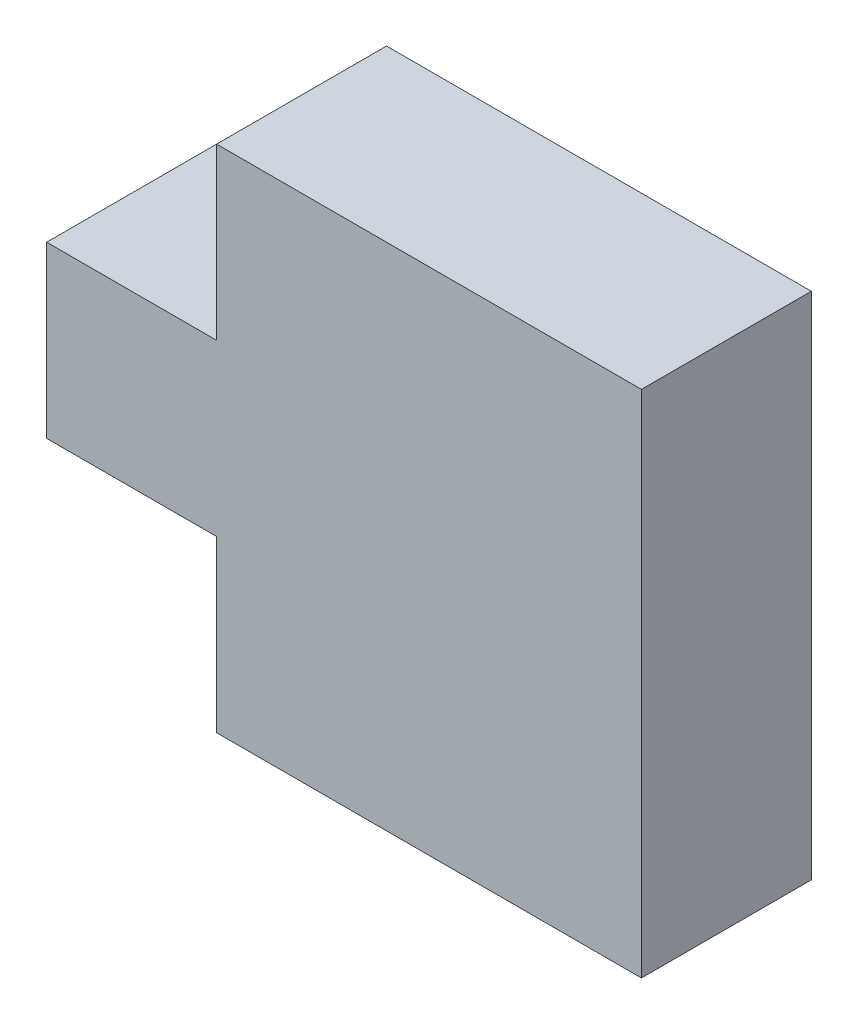
ISO-10303-21;
HEADER;
FILE_DESCRIPTION(('STEP AP214'),'2;1');
FILE_NAME('part.step','',(''),(''),'','','');
FILE_SCHEMA(('AUTOMOTIVE_DESIGN { 1 0 10303 214 1 1 1 1 }'));
ENDSEC;
DATA;
#1=APPLICATION_CONTEXT('core data for automotive mechanical design processes');
#2=APPLICATION_PROTOCOL_DEFINITION('international standard','automotive_design',2000,#1);
#3=PRODUCT_CONTEXT('',#1,'mechanical');
#4=PRODUCT('Part','Part','',(#3));
#5=PRODUCT_RELATED_PRODUCT_CATEGORY('part','',(#4));
#6=PRODUCT_DEFINITION_FORMATION('','',#4);
#7=PRODUCT_DEFINITION_CONTEXT('part definition',#1,'design');
#8=PRODUCT_DEFINITION('design','',#6,#7);
#9=PRODUCT_DEFINITION_SHAPE('','',#8);
#10=(LENGTH_UNIT() NAMED_UNIT(*) SI_UNIT(.MILLI.,.METRE.));
#11=(NAMED_UNIT(*) PLANE_ANGLE_UNIT() SI_UNIT($,.RADIAN.));
#12=(NAMED_UNIT(*) SI_UNIT($,.STERADIAN.) SOLID_ANGLE_UNIT());
#13=UNCERTAINTY_MEASURE_WITH_UNIT(LENGTH_MEASURE(1.E-05),#10,'distance_accuracy_value','');
#14=(GEOMETRIC_REPRESENTATION_CONTEXT(3) GLOBAL_UNCERTAINTY_ASSIGNED_CONTEXT((#13)) GLOBAL_UNIT_ASSIGNED_CONTEXT((#10,
#11,#12)) REPRESENTATION_CONTEXT('',''));
#15=CARTESIAN_POINT('',(0.,0.,0.));
#16=DIRECTION('',(0.,0.,1.));
#17=DIRECTION('',(1.,0.,0.));
#18=AXIS2_PLACEMENT_3D('',#15,#16,#17);
#19=CARTESIAN_POINT('',(0.,0.,20.));
#20=DIRECTION('',(1.,0.,0.));
#21=DIRECTION('',(0.,0.,-1.));
#22=AXIS2_PLACEMENT_3D('',#19,#20,#21);
#23=PLANE('',#22);
#24=DIRECTION('',(0.,-1.,0.));
#25=VECTOR('',#24,1.);
#26=CARTESIAN_POINT('',(0.,0.,0.));
#27=LINE('',#26,#25);
#28=CARTESIAN_POINT('',(0.,20.,0.));
#29=VERTEX_POINT('',#28);
#30=CARTESIAN_POINT('',(0.,0.,0.));
#31=VERTEX_POINT('',#30);
#32=EDGE_CURVE('E132',#29,#31,#27,.T.);
#33=ORIENTED_EDGE('',*,*,#32,.T.);
#34=DIRECTION('',(0.,0.,-1.));
#35=VECTOR('',#34,1.);
#36=CARTESIAN_POINT('',(0.,0.,20.));
#37=LINE('',#36,#35);
#38=CARTESIAN_POINT('',(0.,0.,20.));
#39=VERTEX_POINT('',#38);
#40=EDGE_CURVE('E11',#39,#31,#37,.T.);
#41=ORIENTED_EDGE('',*,*,#40,.F.);
#42=DIRECTION('',(0.,-1.,0.));
#43=VECTOR('',#42,1.);
#44=CARTESIAN_POINT('',(0.,0.,20.));
#45=LINE('',#44,#43);
#46=CARTESIAN_POINT('',(0.,20.,20.));
#47=VERTEX_POINT('',#46);
#48=EDGE_CURVE('E146',#47,#39,#45,.T.);
#49=ORIENTED_EDGE('',*,*,#48,.F.);
#50=DIRECTION('',(0.,0.,-1.));
#51=VECTOR('',#50,1.);
#52=CARTESIAN_POINT('',(0.,20.,20.));
#53=LINE('',#52,#51);
#54=EDGE_CURVE('E128',#47,#29,#53,.T.);
#55=ORIENTED_EDGE('',*,*,#54,.T.);
#56=EDGE_LOOP('',(#33,#41,#49,#55));
#57=FACE_BOUND('',#56,.T.);
#58=ADVANCED_FACE('F36',(#57),#23,.F.);
#59=CARTESIAN_POINT('',(0.,0.,20.));
#60=DIRECTION('',(0.,1.,0.));
#61=DIRECTION('',(0.,0.,1.));
#62=AXIS2_PLACEMENT_3D('',#59,#60,#61);
#63=PLANE('',#62);
#64=DIRECTION('',(1.,0.,0.));
#65=VECTOR('',#64,1.);
#66=CARTESIAN_POINT('',(0.,0.,0.));
#67=LINE('',#66,#65);
#68=CARTESIAN_POINT('',(50.,0.,0.));
#69=VERTEX_POINT('',#68);
#70=EDGE_CURVE('E135',#31,#69,#67,.T.);
#71=ORIENTED_EDGE('',*,*,#70,.T.);
#72=DIRECTION('',(0.,0.,-1.));
#73=VECTOR('',#72,1.);
#74=CARTESIAN_POINT('',(50.,0.,20.));
#75=LINE('',#74,#73);
#76=CARTESIAN_POINT('',(50.,0.,20.));
#77=VERTEX_POINT('',#76);
#78=EDGE_CURVE('E44',#77,#69,#75,.T.);
#79=ORIENTED_EDGE('',*,*,#78,.F.);
#80=DIRECTION('',(1.,0.,0.));
#81=VECTOR('',#80,1.);
#82=CARTESIAN_POINT('',(0.,0.,20.));
#83=LINE('',#82,#81);
#84=EDGE_CURVE('E95',#39,#77,#83,.T.);
#85=ORIENTED_EDGE('',*,*,#84,.F.);
#86=ORIENTED_EDGE('',*,*,#40,.T.);
#87=EDGE_LOOP('',(#71,#79,#85,#86));
#88=FACE_BOUND('',#87,.T.);
#89=ADVANCED_FACE('F181',(#88),#63,.F.);
#90=CARTESIAN_POINT('',(50.,0.,20.));
#91=DIRECTION('',(-1.,0.,0.));
#92=DIRECTION('',(0.,0.,1.));
#93=AXIS2_PLACEMENT_3D('',#90,#91,#92);
#94=PLANE('',#93);
#95=DIRECTION('',(0.,1.,0.));
#96=VECTOR('',#95,1.);
#97=CARTESIAN_POINT('',(50.,0.,0.));
#98=LINE('',#97,#96);
#99=CARTESIAN_POINT('',(50.,60.,0.));
#100=VERTEX_POINT('',#99);
#101=EDGE_CURVE('E137',#69,#100,#98,.T.);
#102=ORIENTED_EDGE('',*,*,#101,.T.);
#103=DIRECTION('',(0.,0.,-1.));
#104=VECTOR('',#103,1.);
#105=CARTESIAN_POINT('',(50.,60.,20.));
#106=LINE('',#105,#104);
#107=CARTESIAN_POINT('',(50.,60.,20.));
#108=VERTEX_POINT('',#107);
#109=EDGE_CURVE('E153',#108,#100,#106,.T.);
#110=ORIENTED_EDGE('',*,*,#109,.F.);
#111=DIRECTION('',(0.,1.,0.));
#112=VECTOR('',#111,1.);
#113=CARTESIAN_POINT('',(50.,0.,20.));
#114=LINE('',#113,#112);
#115=EDGE_CURVE('E161',#77,#108,#114,.T.);
#116=ORIENTED_EDGE('',*,*,#115,.F.);
#117=ORIENTED_EDGE('',*,*,#78,.T.);
#118=EDGE_LOOP('',(#102,#110,#116,#117));
#119=FACE_BOUND('',#118,.T.);
#120=ADVANCED_FACE('F159',(#119),#94,.F.);
#121=CARTESIAN_POINT('',(0.,60.,20.));
#122=DIRECTION('',(0.,-1.,0.));
#123=DIRECTION('',(0.,0.,-1.));
#124=AXIS2_PLACEMENT_3D('',#121,#122,#123);
#125=PLANE('',#124);
#126=DIRECTION('',(-1.,0.,0.));
#127=VECTOR('',#126,1.);
#128=CARTESIAN_POINT('',(0.,60.,0.));
#129=LINE('',#128,#127);
#130=CARTESIAN_POINT('',(0.,60.,0.));
#131=VERTEX_POINT('',#130);
#132=EDGE_CURVE('E139',#100,#131,#129,.T.);
#133=ORIENTED_EDGE('',*,*,#132,.T.);
#134=DIRECTION('',(0.,0.,-1.));
#135=VECTOR('',#134,1.);
#136=CARTESIAN_POINT('',(0.,60.,20.));
#137=LINE('',#136,#135);
#138=CARTESIAN_POINT('',(0.,60.,20.));
#139=VERTEX_POINT('',#138);
#140=EDGE_CURVE('E150',#139,#131,#137,.T.);
#141=ORIENTED_EDGE('',*,*,#140,.F.);
#142=DIRECTION('',(-1.,0.,0.));
#143=VECTOR('',#142,1.);
#144=CARTESIAN_POINT('',(0.,60.,20.));
#145=LINE('',#144,#143);
#146=EDGE_CURVE('E173',#108,#139,#145,.T.);
#147=ORIENTED_EDGE('',*,*,#146,.F.);
#148=ORIENTED_EDGE('',*,*,#109,.T.);
#149=EDGE_LOOP('',(#133,#141,#147,#148));
#150=FACE_BOUND('',#149,.T.);
#151=ADVANCED_FACE('F169',(#150),#125,.F.);
#152=CARTESIAN_POINT('',(0.,40.,20.));
#153=DIRECTION('',(1.,0.,0.));
#154=DIRECTION('',(0.,0.,-1.));
#155=AXIS2_PLACEMENT_3D('',#152,#153,#154);
#156=PLANE('',#155);
#157=DIRECTION('',(0.,-1.,0.));
#158=VECTOR('',#157,1.);
#159=CARTESIAN_POINT('',(0.,40.,0.));
#160=LINE('',#159,#158);
#161=CARTESIAN_POINT('',(0.,40.,0.));
#162=VERTEX_POINT('',#161);
#163=EDGE_CURVE('E141',#131,#162,#160,.T.);
#164=ORIENTED_EDGE('',*,*,#163,.T.);
#165=DIRECTION('',(0.,0.,-1.));
#166=VECTOR('',#165,1.);
#167=CARTESIAN_POINT('',(0.,40.,20.));
#168=LINE('',#167,#166);
#169=CARTESIAN_POINT('',(0.,40.,20.));
#170=VERTEX_POINT('',#169);
#171=EDGE_CURVE('E123',#170,#162,#168,.T.);
#172=ORIENTED_EDGE('',*,*,#171,.F.);
#173=DIRECTION('',(0.,-1.,0.));
#174=VECTOR('',#173,1.);
#175=CARTESIAN_POINT('',(0.,40.,20.));
#176=LINE('',#175,#174);
#177=EDGE_CURVE('E114',#139,#170,#176,.T.);
#178=ORIENTED_EDGE('',*,*,#177,.F.);
#179=ORIENTED_EDGE('',*,*,#140,.T.);
#180=EDGE_LOOP('',(#164,#172,#178,#179));
#181=FACE_BOUND('',#180,.T.);
#182=ADVANCED_FACE('F172',(#181),#156,.F.);
#183=CARTESIAN_POINT('',(0.,40.,20.));
#184=DIRECTION('',(0.,-1.,0.));
#185=DIRECTION('',(0.,0.,-1.));
#186=AXIS2_PLACEMENT_3D('',#183,#184,#185);
#187=PLANE('',#186);
#188=DIRECTION('',(-1.,0.,0.));
#189=VECTOR('',#188,1.);
#190=CARTESIAN_POINT('',(0.,40.,0.));
#191=LINE('',#190,#189);
#192=CARTESIAN_POINT('',(-20.,40.,0.));
#193=VERTEX_POINT('',#192);
#194=EDGE_CURVE('E122',#162,#193,#191,.T.);
#195=ORIENTED_EDGE('',*,*,#194,.T.);
#196=DIRECTION('',(0.,0.,-1.));
#197=VECTOR('',#196,1.);
#198=CARTESIAN_POINT('',(-20.,40.,20.));
#199=LINE('',#198,#197);
#200=CARTESIAN_POINT('',(-20.,40.,20.));
#201=VERTEX_POINT('',#200);
#202=EDGE_CURVE('E119',#201,#193,#199,.T.);
#203=ORIENTED_EDGE('',*,*,#202,.F.);
#204=DIRECTION('',(-1.,0.,0.));
#205=VECTOR('',#204,1.);
#206=CARTESIAN_POINT('',(0.,40.,20.));
#207=LINE('',#206,#205);
#208=EDGE_CURVE('E108',#170,#201,#207,.T.);
#209=ORIENTED_EDGE('',*,*,#208,.F.);
#210=ORIENTED_EDGE('',*,*,#171,.T.);
#211=EDGE_LOOP('',(#195,#203,#209,#210));
#212=FACE_BOUND('',#211,.T.);
#213=ADVANCED_FACE('F120',(#212),#187,.F.);
#214=CARTESIAN_POINT('',(-20.,40.,20.));
#215=DIRECTION('',(1.,0.,0.));
#216=DIRECTION('',(0.,1.,0.));
#217=AXIS2_PLACEMENT_3D('',#214,#215,#216);
#218=PLANE('',#217);
#219=DIRECTION('',(0.,-1.,0.));
#220=VECTOR('',#219,1.);
#221=CARTESIAN_POINT('',(-20.,40.,0.));
#222=LINE('',#221,#220);
#223=CARTESIAN_POINT('',(-20.,20.,0.));
#224=VERTEX_POINT('',#223);
#225=EDGE_CURVE('E81',#193,#224,#222,.T.);
#226=ORIENTED_EDGE('',*,*,#225,.T.);
#227=DIRECTION('',(0.,0.,-1.));
#228=VECTOR('',#227,1.);
#229=CARTESIAN_POINT('',(-20.,20.,20.));
#230=LINE('',#229,#228);
#231=CARTESIAN_POINT('',(-20.,20.,20.));
#232=VERTEX_POINT('',#231);
#233=EDGE_CURVE('E124',#232,#224,#230,.T.);
#234=ORIENTED_EDGE('',*,*,#233,.F.);
#235=DIRECTION('',(0.,-1.,0.));
#236=VECTOR('',#235,1.);
#237=CARTESIAN_POINT('',(-20.,40.,20.));
#238=LINE('',#237,#236);
#239=EDGE_CURVE('E112',#201,#232,#238,.T.);
#240=ORIENTED_EDGE('',*,*,#239,.F.);
#241=ORIENTED_EDGE('',*,*,#202,.T.);
#242=EDGE_LOOP('',(#226,#234,#240,#241));
#243=FACE_BOUND('',#242,.T.);
#244=ADVANCED_FACE('F126',(#243),#218,.F.);
#245=CARTESIAN_POINT('',(-20.,20.,20.));
#246=DIRECTION('',(0.,1.,0.));
#247=DIRECTION('',(0.,0.,1.));
#248=AXIS2_PLACEMENT_3D('',#245,#246,#247);
#249=PLANE('',#248);
#250=DIRECTION('',(1.,0.,0.));
#251=VECTOR('',#250,1.);
#252=CARTESIAN_POINT('',(-20.,20.,0.));
#253=LINE('',#252,#251);
#254=EDGE_CURVE('E87',#224,#29,#253,.T.);
#255=ORIENTED_EDGE('',*,*,#254,.T.);
#256=ORIENTED_EDGE('',*,*,#54,.F.);
#257=DIRECTION('',(1.,0.,0.));
#258=VECTOR('',#257,1.);
#259=CARTESIAN_POINT('',(-20.,20.,20.));
#260=LINE('',#259,#258);
#261=EDGE_CURVE('E52',#232,#47,#260,.T.);
#262=ORIENTED_EDGE('',*,*,#261,.F.);
#263=ORIENTED_EDGE('',*,*,#233,.T.);
#264=EDGE_LOOP('',(#255,#256,#262,#263));
#265=FACE_BOUND('',#264,.T.);
#266=ADVANCED_FACE('F197',(#265),#249,.F.);
#267=CARTESIAN_POINT('',(0.,0.,20.));
#268=DIRECTION('',(0.,0.,-1.));
#269=DIRECTION('',(-1.,0.,0.));
#270=AXIS2_PLACEMENT_3D('',#267,#268,#269);
#271=PLANE('',#270);
#272=ORIENTED_EDGE('',*,*,#48,.T.);
#273=ORIENTED_EDGE('',*,*,#84,.T.);
#274=ORIENTED_EDGE('',*,*,#115,.T.);
#275=ORIENTED_EDGE('',*,*,#146,.T.);
#276=ORIENTED_EDGE('',*,*,#177,.T.);
#277=ORIENTED_EDGE('',*,*,#208,.T.);
#278=ORIENTED_EDGE('',*,*,#239,.T.);
#279=ORIENTED_EDGE('',*,*,#261,.T.);
#280=EDGE_LOOP('',(#272,#273,#274,#275,#276,#277,#278,#279));
#281=FACE_BOUND('',#280,.T.);
#282=ADVANCED_FACE('F110',(#281),#271,.F.);
#283=CARTESIAN_POINT('',(0.,0.,0.));
#284=DIRECTION('',(0.,0.,-1.));
#285=DIRECTION('',(-1.,0.,0.));
#286=AXIS2_PLACEMENT_3D('',#283,#284,#285);
#287=PLANE('',#286);
#288=ORIENTED_EDGE('',*,*,#32,.F.);
#289=ORIENTED_EDGE('',*,*,#254,.F.);
#290=ORIENTED_EDGE('',*,*,#225,.F.);
#291=ORIENTED_EDGE('',*,*,#194,.F.);
#292=ORIENTED_EDGE('',*,*,#163,.F.);
#293=ORIENTED_EDGE('',*,*,#132,.F.);
#294=ORIENTED_EDGE('',*,*,#101,.F.);
#295=ORIENTED_EDGE('',*,*,#70,.F.);
#296=EDGE_LOOP('',(#288,#289,#290,#291,#292,#293,#294,#295));
#297=FACE_BOUND('',#296,.T.);
#298=ADVANCED_FACE('F165',(#297),#287,.T.);
#299=CLOSED_SHELL('',(#58,#89,#120,#151,#182,#213,#244,#266,#282,#298));
#300=MANIFOLD_SOLID_BREP('B2',#299);
#301=ADVANCED_BREP_SHAPE_REPRESENTATION('',(#18,#300),#14);
#302=SHAPE_DEFINITION_REPRESENTATION(#9,#301);
ENDSEC;
END-ISO-10303-21;
